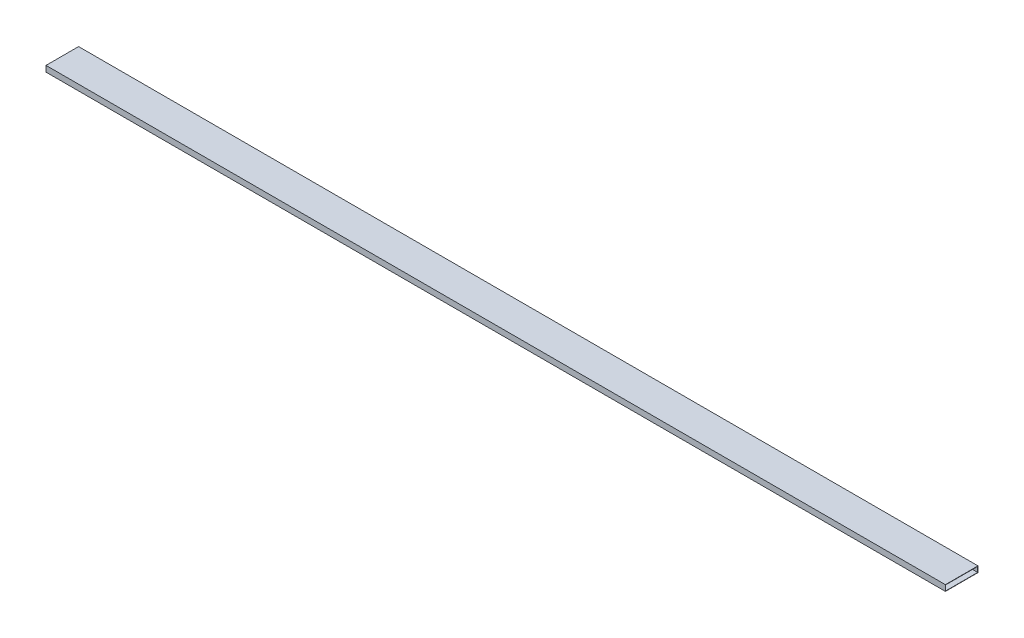
ISO-10303-21;
HEADER;
FILE_DESCRIPTION(('STEP AP214'),'2;1');
FILE_NAME('part.step','',(''),(''),'','','');
FILE_SCHEMA(('AUTOMOTIVE_DESIGN { 1 0 10303 214 1 1 1 1 }'));
ENDSEC;
DATA;
#1=APPLICATION_CONTEXT('core data for automotive mechanical design processes');
#2=APPLICATION_PROTOCOL_DEFINITION('international standard','automotive_design',2000,#1);
#3=PRODUCT_CONTEXT('',#1,'mechanical');
#4=PRODUCT('Part','Part','',(#3));
#5=PRODUCT_RELATED_PRODUCT_CATEGORY('part','',(#4));
#6=PRODUCT_DEFINITION_FORMATION('','',#4);
#7=PRODUCT_DEFINITION_CONTEXT('part definition',#1,'design');
#8=PRODUCT_DEFINITION('design','',#6,#7);
#9=PRODUCT_DEFINITION_SHAPE('','',#8);
#10=(LENGTH_UNIT() NAMED_UNIT(*) SI_UNIT(.MILLI.,.METRE.));
#11=(NAMED_UNIT(*) PLANE_ANGLE_UNIT() SI_UNIT($,.RADIAN.));
#12=(NAMED_UNIT(*) SI_UNIT($,.STERADIAN.) SOLID_ANGLE_UNIT());
#13=UNCERTAINTY_MEASURE_WITH_UNIT(LENGTH_MEASURE(1.E-05),#10,'distance_accuracy_value','');
#14=(GEOMETRIC_REPRESENTATION_CONTEXT(3) GLOBAL_UNCERTAINTY_ASSIGNED_CONTEXT((#13)) GLOBAL_UNIT_ASSIGNED_CONTEXT((#10,
#11,#12)) REPRESENTATION_CONTEXT('',''));
#15=CARTESIAN_POINT('',(0.,0.,0.));
#16=DIRECTION('',(0.,0.,1.));
#17=DIRECTION('',(1.,0.,0.));
#18=AXIS2_PLACEMENT_3D('',#15,#16,#17);
#19=CARTESIAN_POINT('',(-1752.6,-5.715,62.8904000000002));
#20=DIRECTION('',(0.,-1.,0.));
#21=DIRECTION('',(0.,0.,-1.));
#22=AXIS2_PLACEMENT_3D('',#19,#20,#21);
#23=PLANE('',#22);
#24=DIRECTION('',(0.,0.,-1.));
#25=VECTOR('',#24,1.);
#26=CARTESIAN_POINT('',(0.,-5.715,62.8904000000002));
#27=LINE('',#26,#25);
#28=CARTESIAN_POINT('',(0.,-5.715,62.8904000000002));
#29=VERTEX_POINT('',#28);
#30=CARTESIAN_POINT('',(0.,-5.715,-0.6096));
#31=VERTEX_POINT('',#30);
#32=EDGE_CURVE('E137',#29,#31,#27,.T.);
#33=ORIENTED_EDGE('',*,*,#32,.F.);
#34=DIRECTION('',(1.,0.,0.));
#35=VECTOR('',#34,1.);
#36=CARTESIAN_POINT('',(-1752.6,-5.715,62.8904000000002));
#37=LINE('',#36,#35);
#38=CARTESIAN_POINT('',(-1752.6,-5.715,62.8904000000002));
#39=VERTEX_POINT('',#38);
#40=EDGE_CURVE('E11',#39,#29,#37,.T.);
#41=ORIENTED_EDGE('',*,*,#40,.F.);
#42=DIRECTION('',(0.,0.,-1.));
#43=VECTOR('',#42,1.);
#44=CARTESIAN_POINT('',(-1752.6,-5.715,62.8904000000002));
#45=LINE('',#44,#43);
#46=CARTESIAN_POINT('',(-1752.6,-5.715,-0.6096));
#47=VERTEX_POINT('',#46);
#48=EDGE_CURVE('E142',#39,#47,#45,.T.);
#49=ORIENTED_EDGE('',*,*,#48,.T.);
#50=DIRECTION('',(1.,0.,0.));
#51=VECTOR('',#50,1.);
#52=CARTESIAN_POINT('',(-1752.6,-5.715,-0.6096));
#53=LINE('',#52,#51);
#54=EDGE_CURVE('E39',#47,#31,#53,.T.);
#55=ORIENTED_EDGE('',*,*,#54,.T.);
#56=EDGE_LOOP('',(#33,#41,#49,#55));
#57=FACE_BOUND('',#56,.T.);
#58=ADVANCED_FACE('F36',(#57),#23,.T.);
#59=CARTESIAN_POINT('',(-1752.6,5.715,62.8904000000002));
#60=DIRECTION('',(0.,0.,1.));
#61=DIRECTION('',(1.,0.,0.));
#62=AXIS2_PLACEMENT_3D('',#59,#60,#61);
#63=PLANE('',#62);
#64=DIRECTION('',(0.,-1.,0.));
#65=VECTOR('',#64,1.);
#66=CARTESIAN_POINT('',(0.,5.715,62.8904000000002));
#67=LINE('',#66,#65);
#68=CARTESIAN_POINT('',(0.,5.715,62.8904000000002));
#69=VERTEX_POINT('',#68);
#70=EDGE_CURVE('E146',#69,#29,#67,.T.);
#71=ORIENTED_EDGE('',*,*,#70,.F.);
#72=DIRECTION('',(1.,0.,0.));
#73=VECTOR('',#72,1.);
#74=CARTESIAN_POINT('',(-1752.6,5.715,62.8904000000002));
#75=LINE('',#74,#73);
#76=CARTESIAN_POINT('',(-1752.6,5.715,62.8904000000002));
#77=VERTEX_POINT('',#76);
#78=EDGE_CURVE('E45',#77,#69,#75,.T.);
#79=ORIENTED_EDGE('',*,*,#78,.F.);
#80=DIRECTION('',(0.,-1.,0.));
#81=VECTOR('',#80,1.);
#82=CARTESIAN_POINT('',(-1752.6,5.715,62.8904000000002));
#83=LINE('',#82,#81);
#84=EDGE_CURVE('E152',#77,#39,#83,.T.);
#85=ORIENTED_EDGE('',*,*,#84,.T.);
#86=ORIENTED_EDGE('',*,*,#40,.T.);
#87=EDGE_LOOP('',(#71,#79,#85,#86));
#88=FACE_BOUND('',#87,.T.);
#89=ADVANCED_FACE('F183',(#88),#63,.T.);
#90=CARTESIAN_POINT('',(-1752.6,5.715,-0.6096));
#91=DIRECTION('',(0.,1.,0.));
#92=DIRECTION('',(0.,0.,1.));
#93=AXIS2_PLACEMENT_3D('',#90,#91,#92);
#94=PLANE('',#93);
#95=DIRECTION('',(0.,0.,1.));
#96=VECTOR('',#95,1.);
#97=CARTESIAN_POINT('',(0.,5.715,-0.6096));
#98=LINE('',#97,#96);
#99=CARTESIAN_POINT('',(0.,5.715,-0.6096));
#100=VERTEX_POINT('',#99);
#101=EDGE_CURVE('E160',#100,#69,#98,.T.);
#102=ORIENTED_EDGE('',*,*,#101,.F.);
#103=DIRECTION('',(1.,0.,0.));
#104=VECTOR('',#103,1.);
#105=CARTESIAN_POINT('',(-1752.6,5.715,-0.6096));
#106=LINE('',#105,#104);
#107=CARTESIAN_POINT('',(-1752.6,5.715,-0.6096));
#108=VERTEX_POINT('',#107);
#109=EDGE_CURVE('E167',#108,#100,#106,.T.);
#110=ORIENTED_EDGE('',*,*,#109,.F.);
#111=DIRECTION('',(0.,0.,1.));
#112=VECTOR('',#111,1.);
#113=CARTESIAN_POINT('',(-1752.6,5.715,-0.6096));
#114=LINE('',#113,#112);
#115=EDGE_CURVE('E149',#108,#77,#114,.T.);
#116=ORIENTED_EDGE('',*,*,#115,.T.);
#117=ORIENTED_EDGE('',*,*,#78,.T.);
#118=EDGE_LOOP('',(#102,#110,#116,#117));
#119=FACE_BOUND('',#118,.T.);
#120=ADVANCED_FACE('F187',(#119),#94,.T.);
#121=CARTESIAN_POINT('',(-1752.6,-5.715,-0.6096));
#122=DIRECTION('',(0.,0.,-1.));
#123=DIRECTION('',(-1.,0.,0.));
#124=AXIS2_PLACEMENT_3D('',#121,#122,#123);
#125=PLANE('',#124);
#126=DIRECTION('',(0.,1.,0.));
#127=VECTOR('',#126,1.);
#128=CARTESIAN_POINT('',(0.,-5.715,-0.6096));
#129=LINE('',#128,#127);
#130=EDGE_CURVE('E157',#31,#100,#129,.T.);
#131=ORIENTED_EDGE('',*,*,#130,.F.);
#132=ORIENTED_EDGE('',*,*,#54,.F.);
#133=DIRECTION('',(0.,1.,0.));
#134=VECTOR('',#133,1.);
#135=CARTESIAN_POINT('',(-1752.6,-5.715,-0.6096));
#136=LINE('',#135,#134);
#137=EDGE_CURVE('E145',#47,#108,#136,.T.);
#138=ORIENTED_EDGE('',*,*,#137,.T.);
#139=ORIENTED_EDGE('',*,*,#109,.T.);
#140=EDGE_LOOP('',(#131,#132,#138,#139));
#141=FACE_BOUND('',#140,.T.);
#142=ADVANCED_FACE('F178',(#141),#125,.T.);
#143=CARTESIAN_POINT('',(-1752.6,0.,0.));
#144=DIRECTION('',(1.,0.,0.));
#145=DIRECTION('',(0.,0.,-1.));
#146=AXIS2_PLACEMENT_3D('',#143,#144,#145);
#147=PLANE('',#146);
#148=DIRECTION('',(0.,0.,1.));
#149=VECTOR('',#148,1.);
#150=CARTESIAN_POINT('',(-1752.6,5.1054,0.));
#151=LINE('',#150,#149);
#152=CARTESIAN_POINT('',(-1752.6,5.1054,0.));
#153=VERTEX_POINT('',#152);
#154=CARTESIAN_POINT('',(-1752.6,5.1054,62.2808000000002));
#155=VERTEX_POINT('',#154);
#156=EDGE_CURVE('E111',#153,#155,#151,.T.);
#157=ORIENTED_EDGE('',*,*,#156,.T.);
#158=DIRECTION('',(0.,-1.,0.));
#159=VECTOR('',#158,1.);
#160=CARTESIAN_POINT('',(-1752.6,5.1054,62.2808000000002));
#161=LINE('',#160,#159);
#162=CARTESIAN_POINT('',(-1752.6,-5.1054,62.2808000000002));
#163=VERTEX_POINT('',#162);
#164=EDGE_CURVE('E104',#155,#163,#161,.T.);
#165=ORIENTED_EDGE('',*,*,#164,.T.);
#166=DIRECTION('',(0.,0.,-1.));
#167=VECTOR('',#166,1.);
#168=CARTESIAN_POINT('',(-1752.6,-5.1054,62.2808000000002));
#169=LINE('',#168,#167);
#170=CARTESIAN_POINT('',(-1752.6,-5.1054,0.));
#171=VERTEX_POINT('',#170);
#172=EDGE_CURVE('E114',#163,#171,#169,.T.);
#173=ORIENTED_EDGE('',*,*,#172,.T.);
#174=DIRECTION('',(0.,1.,0.));
#175=VECTOR('',#174,1.);
#176=CARTESIAN_POINT('',(-1752.6,-5.1054,0.));
#177=LINE('',#176,#175);
#178=EDGE_CURVE('E53',#171,#153,#177,.T.);
#179=ORIENTED_EDGE('',*,*,#178,.T.);
#180=EDGE_LOOP('',(#157,#165,#173,#179));
#181=FACE_BOUND('',#180,.T.);
#182=ORIENTED_EDGE('',*,*,#48,.F.);
#183=ORIENTED_EDGE('',*,*,#84,.F.);
#184=ORIENTED_EDGE('',*,*,#115,.F.);
#185=ORIENTED_EDGE('',*,*,#137,.F.);
#186=EDGE_LOOP('',(#182,#183,#184,#185));
#187=FACE_BOUND('',#186,.T.);
#188=ADVANCED_FACE('F118',(#181,#187),#147,.F.);
#189=CARTESIAN_POINT('',(0.,0.,0.));
#190=DIRECTION('',(1.,0.,0.));
#191=DIRECTION('',(0.,0.,-1.));
#192=AXIS2_PLACEMENT_3D('',#189,#190,#191);
#193=PLANE('',#192);
#194=DIRECTION('',(0.,-1.,0.));
#195=VECTOR('',#194,1.);
#196=CARTESIAN_POINT('',(0.,5.1054,62.2808000000002));
#197=LINE('',#196,#195);
#198=CARTESIAN_POINT('',(0.,5.1054,62.2808000000002));
#199=VERTEX_POINT('',#198);
#200=CARTESIAN_POINT('',(0.,-5.1054,62.2808000000002));
#201=VERTEX_POINT('',#200);
#202=EDGE_CURVE('E61',#199,#201,#197,.T.);
#203=ORIENTED_EDGE('',*,*,#202,.F.);
#204=DIRECTION('',(0.,0.,1.));
#205=VECTOR('',#204,1.);
#206=CARTESIAN_POINT('',(0.,5.1054,0.));
#207=LINE('',#206,#205);
#208=CARTESIAN_POINT('',(0.,5.1054,0.));
#209=VERTEX_POINT('',#208);
#210=EDGE_CURVE('E121',#209,#199,#207,.T.);
#211=ORIENTED_EDGE('',*,*,#210,.F.);
#212=DIRECTION('',(0.,1.,0.));
#213=VECTOR('',#212,1.);
#214=CARTESIAN_POINT('',(0.,-5.1054,0.));
#215=LINE('',#214,#213);
#216=CARTESIAN_POINT('',(0.,-5.1054,0.));
#217=VERTEX_POINT('',#216);
#218=EDGE_CURVE('E124',#217,#209,#215,.T.);
#219=ORIENTED_EDGE('',*,*,#218,.F.);
#220=DIRECTION('',(0.,0.,-1.));
#221=VECTOR('',#220,1.);
#222=CARTESIAN_POINT('',(0.,-5.1054,62.2808000000002));
#223=LINE('',#222,#221);
#224=EDGE_CURVE('E130',#201,#217,#223,.T.);
#225=ORIENTED_EDGE('',*,*,#224,.F.);
#226=EDGE_LOOP('',(#203,#211,#219,#225));
#227=FACE_BOUND('',#226,.T.);
#228=ORIENTED_EDGE('',*,*,#32,.T.);
#229=ORIENTED_EDGE('',*,*,#130,.T.);
#230=ORIENTED_EDGE('',*,*,#101,.T.);
#231=ORIENTED_EDGE('',*,*,#70,.T.);
#232=EDGE_LOOP('',(#228,#229,#230,#231));
#233=FACE_BOUND('',#232,.T.);
#234=ADVANCED_FACE('F180',(#227,#233),#193,.T.);
#235=CARTESIAN_POINT('',(-1752.6,5.1054,62.2808000000002));
#236=DIRECTION('',(0.,0.,1.));
#237=DIRECTION('',(1.,0.,0.));
#238=AXIS2_PLACEMENT_3D('',#235,#236,#237);
#239=PLANE('',#238);
#240=ORIENTED_EDGE('',*,*,#202,.T.);
#241=DIRECTION('',(1.,0.,0.));
#242=VECTOR('',#241,1.);
#243=CARTESIAN_POINT('',(-1752.6,-5.1054,62.2808000000002));
#244=LINE('',#243,#242);
#245=EDGE_CURVE('E100',#163,#201,#244,.T.);
#246=ORIENTED_EDGE('',*,*,#245,.F.);
#247=ORIENTED_EDGE('',*,*,#164,.F.);
#248=DIRECTION('',(1.,0.,0.));
#249=VECTOR('',#248,1.);
#250=CARTESIAN_POINT('',(-1752.6,5.1054,62.2808000000002));
#251=LINE('',#250,#249);
#252=EDGE_CURVE('E134',#155,#199,#251,.T.);
#253=ORIENTED_EDGE('',*,*,#252,.T.);
#254=EDGE_LOOP('',(#240,#246,#247,#253));
#255=FACE_BOUND('',#254,.T.);
#256=ADVANCED_FACE('F102',(#255),#239,.F.);
#257=CARTESIAN_POINT('',(-1752.6,5.1054,0.));
#258=DIRECTION('',(0.,1.,0.));
#259=DIRECTION('',(0.,0.,1.));
#260=AXIS2_PLACEMENT_3D('',#257,#258,#259);
#261=PLANE('',#260);
#262=ORIENTED_EDGE('',*,*,#210,.T.);
#263=ORIENTED_EDGE('',*,*,#252,.F.);
#264=ORIENTED_EDGE('',*,*,#156,.F.);
#265=DIRECTION('',(1.,0.,0.));
#266=VECTOR('',#265,1.);
#267=CARTESIAN_POINT('',(-1752.6,5.1054,0.));
#268=LINE('',#267,#266);
#269=EDGE_CURVE('E138',#153,#209,#268,.T.);
#270=ORIENTED_EDGE('',*,*,#269,.T.);
#271=EDGE_LOOP('',(#262,#263,#264,#270));
#272=FACE_BOUND('',#271,.T.);
#273=ADVANCED_FACE('F247',(#272),#261,.F.);
#274=CARTESIAN_POINT('',(-1752.6,-5.1054,0.));
#275=DIRECTION('',(0.,0.,-1.));
#276=DIRECTION('',(-1.,0.,0.));
#277=AXIS2_PLACEMENT_3D('',#274,#275,#276);
#278=PLANE('',#277);
#279=ORIENTED_EDGE('',*,*,#218,.T.);
#280=ORIENTED_EDGE('',*,*,#269,.F.);
#281=ORIENTED_EDGE('',*,*,#178,.F.);
#282=DIRECTION('',(1.,0.,0.));
#283=VECTOR('',#282,1.);
#284=CARTESIAN_POINT('',(-1752.6,-5.1054,0.));
#285=LINE('',#284,#283);
#286=EDGE_CURVE('E110',#171,#217,#285,.T.);
#287=ORIENTED_EDGE('',*,*,#286,.T.);
#288=EDGE_LOOP('',(#279,#280,#281,#287));
#289=FACE_BOUND('',#288,.T.);
#290=ADVANCED_FACE('F256',(#289),#278,.F.);
#291=CARTESIAN_POINT('',(-1752.6,-5.1054,62.2808000000002));
#292=DIRECTION('',(0.,-1.,0.));
#293=DIRECTION('',(0.,0.,-1.));
#294=AXIS2_PLACEMENT_3D('',#291,#292,#293);
#295=PLANE('',#294);
#296=ORIENTED_EDGE('',*,*,#224,.T.);
#297=ORIENTED_EDGE('',*,*,#286,.F.);
#298=ORIENTED_EDGE('',*,*,#172,.F.);
#299=ORIENTED_EDGE('',*,*,#245,.T.);
#300=EDGE_LOOP('',(#296,#297,#298,#299));
#301=FACE_BOUND('',#300,.T.);
#302=ADVANCED_FACE('F115',(#301),#295,.F.);
#303=CLOSED_SHELL('',(#58,#89,#120,#142,#188,#234,#256,#273,#290,#302));
#304=MANIFOLD_SOLID_BREP('B2',#303);
#305=ADVANCED_BREP_SHAPE_REPRESENTATION('',(#18,#304),#14);
#306=SHAPE_DEFINITION_REPRESENTATION(#9,#305);
ENDSEC;
END-ISO-10303-21;
